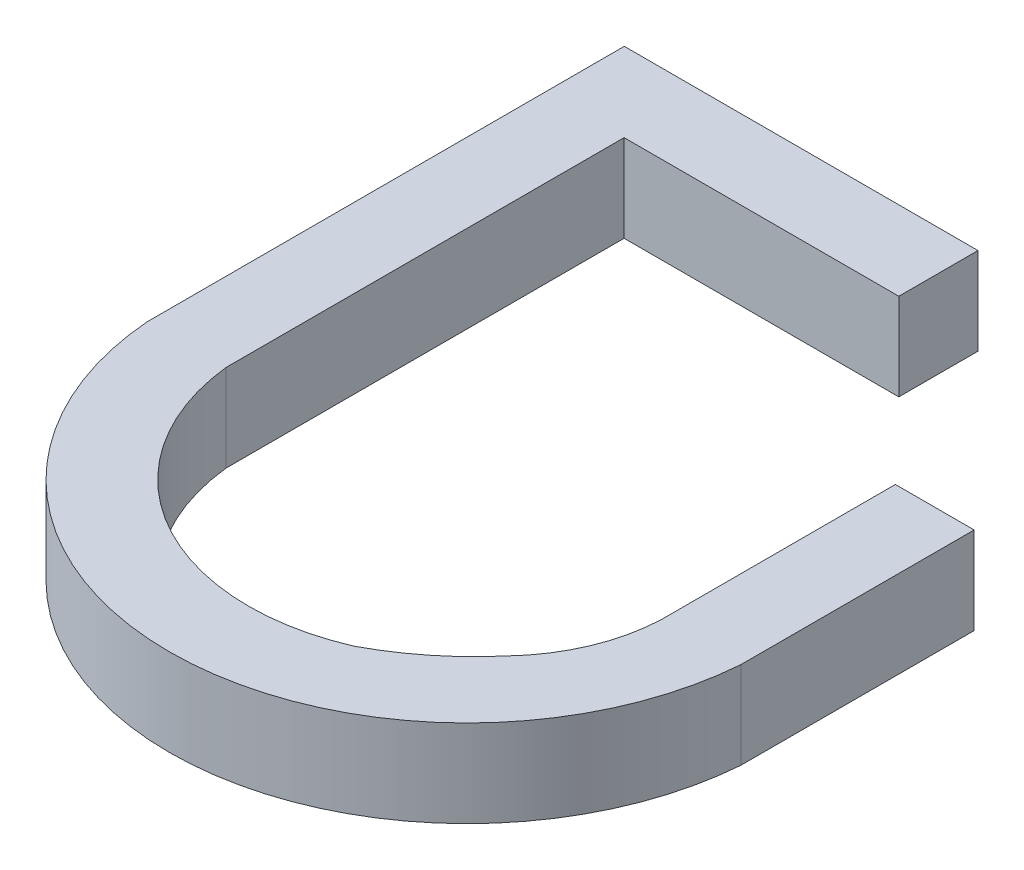
ISO-10303-21;
HEADER;
FILE_DESCRIPTION(('STEP AP214'),'2;1');
FILE_NAME('part.step','',(''),(''),'','','');
FILE_SCHEMA(('AUTOMOTIVE_DESIGN { 1 0 10303 214 1 1 1 1 }'));
ENDSEC;
DATA;
#1=APPLICATION_CONTEXT('core data for automotive mechanical design processes');
#2=APPLICATION_PROTOCOL_DEFINITION('international standard','automotive_design',2000,#1);
#3=PRODUCT_CONTEXT('',#1,'mechanical');
#4=PRODUCT('Part','Part','',(#3));
#5=PRODUCT_RELATED_PRODUCT_CATEGORY('part','',(#4));
#6=PRODUCT_DEFINITION_FORMATION('','',#4);
#7=PRODUCT_DEFINITION_CONTEXT('part definition',#1,'design');
#8=PRODUCT_DEFINITION('design','',#6,#7);
#9=PRODUCT_DEFINITION_SHAPE('','',#8);
#10=(LENGTH_UNIT() NAMED_UNIT(*) SI_UNIT(.MILLI.,.METRE.));
#11=(NAMED_UNIT(*) PLANE_ANGLE_UNIT() SI_UNIT($,.RADIAN.));
#12=(NAMED_UNIT(*) SI_UNIT($,.STERADIAN.) SOLID_ANGLE_UNIT());
#13=UNCERTAINTY_MEASURE_WITH_UNIT(LENGTH_MEASURE(1.E-05),#10,'distance_accuracy_value','');
#14=(GEOMETRIC_REPRESENTATION_CONTEXT(3) GLOBAL_UNCERTAINTY_ASSIGNED_CONTEXT((#13)) GLOBAL_UNIT_ASSIGNED_CONTEXT((#10,
#11,#12)) REPRESENTATION_CONTEXT('',''));
#15=CARTESIAN_POINT('',(0.,0.,0.));
#16=DIRECTION('',(0.,0.,1.));
#17=DIRECTION('',(1.,0.,0.));
#18=AXIS2_PLACEMENT_3D('',#15,#16,#17);
#19=CARTESIAN_POINT('',(86.487166974426,25.4,-86.7884043944306));
#20=DIRECTION('',(0.,1.,0.));
#21=DIRECTION('',(0.,0.,1.));
#22=AXIS2_PLACEMENT_3D('',#19,#20,#21);
#23=PLANE('',#22);
#24=CARTESIAN_POINT('',(86.518970104668,25.4,-86.964878381126));
#25=DIRECTION('',(0.,1.,0.));
#26=DIRECTION('',(0.,0.,1.));
#27=AXIS2_PLACEMENT_3D('',#24,#25,#26);
#28=CIRCLE('',#27,63.8849185867954);
#29=CARTESIAN_POINT('',(23.0118290964539,25.4,-80.0275976599587));
#30=VERTEX_POINT('',#29);
#31=CARTESIAN_POINT('',(112.066438028889,25.4,-28.4105471536038));
#32=VERTEX_POINT('',#31);
#33=EDGE_CURVE('E226',#30,#32,#28,.T.);
#34=ORIENTED_EDGE('',*,*,#33,.F.);
#35=DIRECTION('',(0.,0.,-1.));
#36=VECTOR('',#35,1.);
#37=CARTESIAN_POINT('',(23.0118290964539,25.4,-195.999460881352));
#38=LINE('',#37,#36);
#39=CARTESIAN_POINT('',(23.0118290964539,25.4,-195.999460881352));
#40=VERTEX_POINT('',#39);
#41=EDGE_CURVE('E42',#30,#40,#38,.T.);
#42=ORIENTED_EDGE('',*,*,#41,.T.);
#43=DIRECTION('',(1.,0.,0.));
#44=VECTOR('',#43,1.);
#45=CARTESIAN_POINT('',(103.040086397792,25.4,-195.999460881352));
#46=LINE('',#45,#44);
#47=CARTESIAN_POINT('',(103.040086397792,25.4,-195.999460881352));
#48=VERTEX_POINT('',#47);
#49=EDGE_CURVE('E132',#40,#48,#46,.T.);
#50=ORIENTED_EDGE('',*,*,#49,.T.);
#51=DIRECTION('',(0.,0.,-1.));
#52=VECTOR('',#51,1.);
#53=CARTESIAN_POINT('',(103.040086397792,25.4,-219.067642019415));
#54=LINE('',#53,#52);
#55=CARTESIAN_POINT('',(103.040086397792,25.4,-219.067642019415));
#56=VERTEX_POINT('',#55);
#57=EDGE_CURVE('E125',#48,#56,#54,.T.);
#58=ORIENTED_EDGE('',*,*,#57,.T.);
#59=DIRECTION('',(-1.,0.,0.));
#60=VECTOR('',#59,1.);
#61=CARTESIAN_POINT('',(0.,25.4,-219.067642019415));
#62=LINE('',#61,#60);
#63=CARTESIAN_POINT('',(0.,25.4,-219.067642019415));
#64=VERTEX_POINT('',#63);
#65=EDGE_CURVE('E129',#56,#64,#62,.T.);
#66=ORIENTED_EDGE('',*,*,#65,.T.);
#67=DIRECTION('',(0.,0.,1.));
#68=VECTOR('',#67,1.);
#69=CARTESIAN_POINT('',(0.,25.4,-80.0275976599587));
#70=LINE('',#69,#68);
#71=CARTESIAN_POINT('',(0.,25.4,-80.0275976599587));
#72=VERTEX_POINT('',#71);
#73=EDGE_CURVE('E63',#64,#72,#70,.T.);
#74=ORIENTED_EDGE('',*,*,#73,.T.);
#75=CARTESIAN_POINT('',(86.487166974426,25.4,-86.7884043944306));
#76=DIRECTION('',(0.,1.,0.));
#77=DIRECTION('',(0.,0.,1.));
#78=AXIS2_PLACEMENT_3D('',#75,#76,#77);
#79=CIRCLE('',#78,86.7510147431322);
#80=CARTESIAN_POINT('',(172.974333948852,25.4,-80.0275976599587));
#81=VERTEX_POINT('',#80);
#82=EDGE_CURVE('E173',#72,#81,#79,.T.);
#83=ORIENTED_EDGE('',*,*,#82,.T.);
#84=DIRECTION('',(0.,0.,-1.));
#85=VECTOR('',#84,1.);
#86=CARTESIAN_POINT('',(172.974333948852,25.4,-80.0275976599587));
#87=LINE('',#86,#85);
#88=CARTESIAN_POINT('',(172.974333948852,25.4,-148.011746995585));
#89=VERTEX_POINT('',#88);
#90=EDGE_CURVE('E106',#81,#89,#87,.T.);
#91=ORIENTED_EDGE('',*,*,#90,.T.);
#92=DIRECTION('',(-1.,0.,0.));
#93=VECTOR('',#92,1.);
#94=CARTESIAN_POINT('',(150.026111112882,25.4,-148.011746995585));
#95=LINE('',#94,#93);
#96=CARTESIAN_POINT('',(150.026111112882,25.4,-148.011746995585));
#97=VERTEX_POINT('',#96);
#98=EDGE_CURVE('E195',#89,#97,#95,.T.);
#99=ORIENTED_EDGE('',*,*,#98,.T.);
#100=DIRECTION('',(0.,0.,1.));
#101=VECTOR('',#100,1.);
#102=CARTESIAN_POINT('',(150.026111112882,25.4,-80.0275976599587));
#103=LINE('',#102,#101);
#104=CARTESIAN_POINT('',(150.026111112882,25.4,-80.0275976599587));
#105=VERTEX_POINT('',#104);
#106=EDGE_CURVE('E214',#97,#105,#103,.T.);
#107=ORIENTED_EDGE('',*,*,#106,.T.);
#108=CARTESIAN_POINT('',(101.122321747501,25.4,-81.7614654621829));
#109=DIRECTION('',(0.,-1.,0.));
#110=DIRECTION('',(0.,0.,1.));
#111=AXIS2_PLACEMENT_3D('',#108,#109,#110);
#112=CIRCLE('',#111,48.9345165690762);
#113=CARTESIAN_POINT('',(136.744902109116,25.4,-48.2112243269925));
#114=VERTEX_POINT('',#113);
#115=EDGE_CURVE('E211',#105,#114,#112,.T.);
#116=ORIENTED_EDGE('',*,*,#115,.T.);
#117=CARTESIAN_POINT('',(72.7034977462678,25.4,-102.749601212673));
#118=DIRECTION('',(0.,1.,0.));
#119=DIRECTION('',(0.,0.,1.));
#120=AXIS2_PLACEMENT_3D('',#117,#118,#119);
#121=CIRCLE('',#120,84.1173943134857);
#122=EDGE_CURVE('E229',#32,#114,#121,.T.);
#123=ORIENTED_EDGE('',*,*,#122,.F.);
#124=EDGE_LOOP('',(#34,#42,#50,#58,#66,#74,#83,#91,#99,#107,#116,#123));
#125=FACE_BOUND('',#124,.T.);
#126=ADVANCED_FACE('F38',(#125),#23,.T.);
#127=CARTESIAN_POINT('',(86.487166974426,0.,-86.7884043944306));
#128=DIRECTION('',(0.,1.,0.));
#129=DIRECTION('',(0.,0.,1.));
#130=AXIS2_PLACEMENT_3D('',#127,#128,#129);
#131=PLANE('',#130);
#132=DIRECTION('',(0.,0.,-1.));
#133=VECTOR('',#132,1.);
#134=CARTESIAN_POINT('',(23.0118290964539,0.,-195.999460881352));
#135=LINE('',#134,#133);
#136=CARTESIAN_POINT('',(23.0118290964539,0.,-80.0275976599587));
#137=VERTEX_POINT('',#136);
#138=CARTESIAN_POINT('',(23.0118290964539,0.,-195.999460881352));
#139=VERTEX_POINT('',#138);
#140=EDGE_CURVE('E54',#137,#139,#135,.T.);
#141=ORIENTED_EDGE('',*,*,#140,.F.);
#142=CARTESIAN_POINT('',(86.518970104668,0.,-86.964878381126));
#143=DIRECTION('',(0.,1.,0.));
#144=DIRECTION('',(0.,0.,1.));
#145=AXIS2_PLACEMENT_3D('',#142,#143,#144);
#146=CIRCLE('',#145,63.8849185867954);
#147=CARTESIAN_POINT('',(112.066438028889,0.,-28.4105471536038));
#148=VERTEX_POINT('',#147);
#149=EDGE_CURVE('E227',#137,#148,#146,.T.);
#150=ORIENTED_EDGE('',*,*,#149,.T.);
#151=CARTESIAN_POINT('',(72.7034977462678,0.,-102.749601212673));
#152=DIRECTION('',(0.,1.,0.));
#153=DIRECTION('',(0.,0.,1.));
#154=AXIS2_PLACEMENT_3D('',#151,#152,#153);
#155=CIRCLE('',#154,84.1173943134857);
#156=CARTESIAN_POINT('',(136.744902109116,0.,-48.2112243269925));
#157=VERTEX_POINT('',#156);
#158=EDGE_CURVE('E234',#148,#157,#155,.T.);
#159=ORIENTED_EDGE('',*,*,#158,.T.);
#160=CARTESIAN_POINT('',(101.122321747501,0.,-81.7614654621829));
#161=DIRECTION('',(0.,-1.,0.));
#162=DIRECTION('',(0.,0.,1.));
#163=AXIS2_PLACEMENT_3D('',#160,#161,#162);
#164=CIRCLE('',#163,48.9345165690762);
#165=CARTESIAN_POINT('',(150.026111112882,0.,-80.0275976599587));
#166=VERTEX_POINT('',#165);
#167=EDGE_CURVE('E163',#166,#157,#164,.T.);
#168=ORIENTED_EDGE('',*,*,#167,.F.);
#169=DIRECTION('',(0.,0.,1.));
#170=VECTOR('',#169,1.);
#171=CARTESIAN_POINT('',(150.026111112882,0.,-80.0275976599587));
#172=LINE('',#171,#170);
#173=CARTESIAN_POINT('',(150.026111112882,0.,-148.011746995585));
#174=VERTEX_POINT('',#173);
#175=EDGE_CURVE('E161',#174,#166,#172,.T.);
#176=ORIENTED_EDGE('',*,*,#175,.F.);
#177=DIRECTION('',(-1.,0.,0.));
#178=VECTOR('',#177,1.);
#179=CARTESIAN_POINT('',(150.026111112882,0.,-148.011746995585));
#180=LINE('',#179,#178);
#181=CARTESIAN_POINT('',(172.974333948852,0.,-148.011746995585));
#182=VERTEX_POINT('',#181);
#183=EDGE_CURVE('E159',#182,#174,#180,.T.);
#184=ORIENTED_EDGE('',*,*,#183,.F.);
#185=DIRECTION('',(0.,0.,-1.));
#186=VECTOR('',#185,1.);
#187=CARTESIAN_POINT('',(172.974333948852,0.,-80.0275976599587));
#188=LINE('',#187,#186);
#189=CARTESIAN_POINT('',(172.974333948852,0.,-80.0275976599587));
#190=VERTEX_POINT('',#189);
#191=EDGE_CURVE('E156',#190,#182,#188,.T.);
#192=ORIENTED_EDGE('',*,*,#191,.F.);
#193=CARTESIAN_POINT('',(86.487166974426,0.,-86.7884043944306));
#194=DIRECTION('',(0.,1.,0.));
#195=DIRECTION('',(0.,0.,1.));
#196=AXIS2_PLACEMENT_3D('',#193,#194,#195);
#197=CIRCLE('',#196,86.7510147431322);
#198=CARTESIAN_POINT('',(0.,0.,-80.0275976599587));
#199=VERTEX_POINT('',#198);
#200=EDGE_CURVE('E153',#199,#190,#197,.T.);
#201=ORIENTED_EDGE('',*,*,#200,.F.);
#202=DIRECTION('',(0.,0.,1.));
#203=VECTOR('',#202,1.);
#204=CARTESIAN_POINT('',(0.,0.,-80.0275976599587));
#205=LINE('',#204,#203);
#206=CARTESIAN_POINT('',(0.,0.,-219.067642019415));
#207=VERTEX_POINT('',#206);
#208=EDGE_CURVE('E98',#207,#199,#205,.T.);
#209=ORIENTED_EDGE('',*,*,#208,.F.);
#210=DIRECTION('',(-1.,0.,0.));
#211=VECTOR('',#210,1.);
#212=CARTESIAN_POINT('',(0.,0.,-219.067642019415));
#213=LINE('',#212,#211);
#214=CARTESIAN_POINT('',(103.040086397792,0.,-219.067642019415));
#215=VERTEX_POINT('',#214);
#216=EDGE_CURVE('E170',#215,#207,#213,.T.);
#217=ORIENTED_EDGE('',*,*,#216,.F.);
#218=DIRECTION('',(0.,0.,-1.));
#219=VECTOR('',#218,1.);
#220=CARTESIAN_POINT('',(103.040086397792,0.,-219.067642019415));
#221=LINE('',#220,#219);
#222=CARTESIAN_POINT('',(103.040086397792,0.,-195.999460881352));
#223=VERTEX_POINT('',#222);
#224=EDGE_CURVE('E141',#223,#215,#221,.T.);
#225=ORIENTED_EDGE('',*,*,#224,.F.);
#226=DIRECTION('',(1.,0.,0.));
#227=VECTOR('',#226,1.);
#228=CARTESIAN_POINT('',(103.040086397792,0.,-195.999460881352));
#229=LINE('',#228,#227);
#230=EDGE_CURVE('E167',#139,#223,#229,.T.);
#231=ORIENTED_EDGE('',*,*,#230,.F.);
#232=EDGE_LOOP('',(#141,#150,#159,#168,#176,#184,#192,#201,#209,#217,#225,#231));
#233=FACE_BOUND('',#232,.T.);
#234=ADVANCED_FACE('F197',(#233),#131,.F.);
#235=CARTESIAN_POINT('',(86.487166974426,25.4,-86.7884043944306));
#236=DIRECTION('',(0.,-1.,0.));
#237=DIRECTION('',(0.,0.,-1.));
#238=AXIS2_PLACEMENT_3D('',#235,#236,#237);
#239=CYLINDRICAL_SURFACE('',#238,86.7510147431322);
#240=ORIENTED_EDGE('',*,*,#200,.T.);
#241=DIRECTION('',(0.,-1.,0.));
#242=VECTOR('',#241,1.);
#243=CARTESIAN_POINT('',(172.974333948852,25.4,-80.0275976599587));
#244=LINE('',#243,#242);
#245=EDGE_CURVE('E11',#81,#190,#244,.T.);
#246=ORIENTED_EDGE('',*,*,#245,.F.);
#247=ORIENTED_EDGE('',*,*,#82,.F.);
#248=DIRECTION('',(0.,-1.,0.));
#249=VECTOR('',#248,1.);
#250=CARTESIAN_POINT('',(0.,25.4,-80.0275976599587));
#251=LINE('',#250,#249);
#252=EDGE_CURVE('E149',#72,#199,#251,.T.);
#253=ORIENTED_EDGE('',*,*,#252,.T.);
#254=EDGE_LOOP('',(#240,#246,#247,#253));
#255=FACE_BOUND('',#254,.T.);
#256=ADVANCED_FACE('F40',(#255),#239,.T.);
#257=CARTESIAN_POINT('',(172.974333948852,25.4,-80.0275976599587));
#258=DIRECTION('',(-1.,0.,0.));
#259=DIRECTION('',(0.,0.,1.));
#260=AXIS2_PLACEMENT_3D('',#257,#258,#259);
#261=PLANE('',#260);
#262=ORIENTED_EDGE('',*,*,#191,.T.);
#263=DIRECTION('',(0.,-1.,0.));
#264=VECTOR('',#263,1.);
#265=CARTESIAN_POINT('',(172.974333948852,25.4,-148.011746995585));
#266=LINE('',#265,#264);
#267=EDGE_CURVE('E47',#89,#182,#266,.T.);
#268=ORIENTED_EDGE('',*,*,#267,.F.);
#269=ORIENTED_EDGE('',*,*,#90,.F.);
#270=ORIENTED_EDGE('',*,*,#245,.T.);
#271=EDGE_LOOP('',(#262,#268,#269,#270));
#272=FACE_BOUND('',#271,.T.);
#273=ADVANCED_FACE('F256',(#272),#261,.F.);
#274=CARTESIAN_POINT('',(150.026111112882,25.4,-148.011746995585));
#275=DIRECTION('',(0.,0.,1.));
#276=DIRECTION('',(1.,0.,0.));
#277=AXIS2_PLACEMENT_3D('',#274,#275,#276);
#278=PLANE('',#277);
#279=ORIENTED_EDGE('',*,*,#183,.T.);
#280=DIRECTION('',(0.,-1.,0.));
#281=VECTOR('',#280,1.);
#282=CARTESIAN_POINT('',(150.026111112882,25.4,-148.011746995585));
#283=LINE('',#282,#281);
#284=EDGE_CURVE('E186',#97,#174,#283,.T.);
#285=ORIENTED_EDGE('',*,*,#284,.F.);
#286=ORIENTED_EDGE('',*,*,#98,.F.);
#287=ORIENTED_EDGE('',*,*,#267,.T.);
#288=EDGE_LOOP('',(#279,#285,#286,#287));
#289=FACE_BOUND('',#288,.T.);
#290=ADVANCED_FACE('F193',(#289),#278,.F.);
#291=CARTESIAN_POINT('',(150.026111112882,25.4,-80.0275976599587));
#292=DIRECTION('',(1.,0.,0.));
#293=DIRECTION('',(0.,0.,-1.));
#294=AXIS2_PLACEMENT_3D('',#291,#292,#293);
#295=PLANE('',#294);
#296=ORIENTED_EDGE('',*,*,#175,.T.);
#297=DIRECTION('',(0.,-1.,0.));
#298=VECTOR('',#297,1.);
#299=CARTESIAN_POINT('',(150.026111112882,25.4,-80.0275976599587));
#300=LINE('',#299,#298);
#301=EDGE_CURVE('E183',#105,#166,#300,.T.);
#302=ORIENTED_EDGE('',*,*,#301,.F.);
#303=ORIENTED_EDGE('',*,*,#106,.F.);
#304=ORIENTED_EDGE('',*,*,#284,.T.);
#305=EDGE_LOOP('',(#296,#302,#303,#304));
#306=FACE_BOUND('',#305,.T.);
#307=ADVANCED_FACE('F203',(#306),#295,.F.);
#308=CARTESIAN_POINT('',(101.122321747501,25.4,-81.7614654621829));
#309=DIRECTION('',(0.,-1.,0.));
#310=DIRECTION('',(0.,0.,-1.));
#311=AXIS2_PLACEMENT_3D('',#308,#309,#310);
#312=CYLINDRICAL_SURFACE('',#311,48.9345165690762);
#313=ORIENTED_EDGE('',*,*,#167,.T.);
#314=DIRECTION('',(0.,-1.,0.));
#315=VECTOR('',#314,1.);
#316=CARTESIAN_POINT('',(136.744902109116,25.4,-48.2112243269925));
#317=LINE('',#316,#315);
#318=EDGE_CURVE('E180',#114,#157,#317,.T.);
#319=ORIENTED_EDGE('',*,*,#318,.F.);
#320=ORIENTED_EDGE('',*,*,#115,.F.);
#321=ORIENTED_EDGE('',*,*,#301,.T.);
#322=EDGE_LOOP('',(#313,#319,#320,#321));
#323=FACE_BOUND('',#322,.T.);
#324=ADVANCED_FACE('F207',(#323),#312,.F.);
#325=CARTESIAN_POINT('',(23.0118290964539,25.4,-195.999460881352));
#326=DIRECTION('',(-1.,0.,0.));
#327=DIRECTION('',(0.,0.,1.));
#328=AXIS2_PLACEMENT_3D('',#325,#326,#327);
#329=PLANE('',#328);
#330=ORIENTED_EDGE('',*,*,#140,.T.);
#331=DIRECTION('',(0.,-1.,0.));
#332=VECTOR('',#331,1.);
#333=CARTESIAN_POINT('',(23.0118290964539,25.4,-195.999460881352));
#334=LINE('',#333,#332);
#335=EDGE_CURVE('E177',#40,#139,#334,.T.);
#336=ORIENTED_EDGE('',*,*,#335,.F.);
#337=ORIENTED_EDGE('',*,*,#41,.F.);
#338=DIRECTION('',(0.,-1.,0.));
#339=VECTOR('',#338,1.);
#340=CARTESIAN_POINT('',(23.0118290964539,25.4,-80.0275976599587));
#341=LINE('',#340,#339);
#342=EDGE_CURVE('E223',#30,#137,#341,.T.);
#343=ORIENTED_EDGE('',*,*,#342,.T.);
#344=EDGE_LOOP('',(#330,#336,#337,#343));
#345=FACE_BOUND('',#344,.T.);
#346=ADVANCED_FACE('F249',(#345),#329,.F.);
#347=CARTESIAN_POINT('',(103.040086397792,25.4,-195.999460881352));
#348=DIRECTION('',(0.,0.,-1.));
#349=DIRECTION('',(-1.,0.,0.));
#350=AXIS2_PLACEMENT_3D('',#347,#348,#349);
#351=PLANE('',#350);
#352=ORIENTED_EDGE('',*,*,#230,.T.);
#353=DIRECTION('',(0.,-1.,0.));
#354=VECTOR('',#353,1.);
#355=CARTESIAN_POINT('',(103.040086397792,25.4,-195.999460881352));
#356=LINE('',#355,#354);
#357=EDGE_CURVE('E144',#48,#223,#356,.T.);
#358=ORIENTED_EDGE('',*,*,#357,.F.);
#359=ORIENTED_EDGE('',*,*,#49,.F.);
#360=ORIENTED_EDGE('',*,*,#335,.T.);
#361=EDGE_LOOP('',(#352,#358,#359,#360));
#362=FACE_BOUND('',#361,.T.);
#363=ADVANCED_FACE('F251',(#362),#351,.F.);
#364=CARTESIAN_POINT('',(103.040086397792,25.4,-219.067642019415));
#365=DIRECTION('',(-1.,0.,0.));
#366=DIRECTION('',(0.,0.,1.));
#367=AXIS2_PLACEMENT_3D('',#364,#365,#366);
#368=PLANE('',#367);
#369=ORIENTED_EDGE('',*,*,#224,.T.);
#370=DIRECTION('',(0.,-1.,0.));
#371=VECTOR('',#370,1.);
#372=CARTESIAN_POINT('',(103.040086397792,25.4,-219.067642019415));
#373=LINE('',#372,#371);
#374=EDGE_CURVE('E138',#56,#215,#373,.T.);
#375=ORIENTED_EDGE('',*,*,#374,.F.);
#376=ORIENTED_EDGE('',*,*,#57,.F.);
#377=ORIENTED_EDGE('',*,*,#357,.T.);
#378=EDGE_LOOP('',(#369,#375,#376,#377));
#379=FACE_BOUND('',#378,.T.);
#380=ADVANCED_FACE('F139',(#379),#368,.F.);
#381=CARTESIAN_POINT('',(0.,25.4,-219.067642019415));
#382=DIRECTION('',(0.,0.,1.));
#383=DIRECTION('',(1.,0.,0.));
#384=AXIS2_PLACEMENT_3D('',#381,#382,#383);
#385=PLANE('',#384);
#386=ORIENTED_EDGE('',*,*,#216,.T.);
#387=DIRECTION('',(0.,-1.,0.));
#388=VECTOR('',#387,1.);
#389=CARTESIAN_POINT('',(0.,25.4,-219.067642019415));
#390=LINE('',#389,#388);
#391=EDGE_CURVE('E145',#64,#207,#390,.T.);
#392=ORIENTED_EDGE('',*,*,#391,.F.);
#393=ORIENTED_EDGE('',*,*,#65,.F.);
#394=ORIENTED_EDGE('',*,*,#374,.T.);
#395=EDGE_LOOP('',(#386,#392,#393,#394));
#396=FACE_BOUND('',#395,.T.);
#397=ADVANCED_FACE('F147',(#396),#385,.F.);
#398=CARTESIAN_POINT('',(0.,25.4,-80.0275976599587));
#399=DIRECTION('',(1.,0.,0.));
#400=DIRECTION('',(0.,0.,-1.));
#401=AXIS2_PLACEMENT_3D('',#398,#399,#400);
#402=PLANE('',#401);
#403=ORIENTED_EDGE('',*,*,#208,.T.);
#404=ORIENTED_EDGE('',*,*,#252,.F.);
#405=ORIENTED_EDGE('',*,*,#73,.F.);
#406=ORIENTED_EDGE('',*,*,#391,.T.);
#407=EDGE_LOOP('',(#403,#404,#405,#406));
#408=FACE_BOUND('',#407,.T.);
#409=ADVANCED_FACE('F252',(#408),#402,.F.);
#410=CARTESIAN_POINT('',(86.518970104668,25.4,-86.964878381126));
#411=DIRECTION('',(0.,-1.,0.));
#412=DIRECTION('',(0.,0.,-1.));
#413=AXIS2_PLACEMENT_3D('',#410,#411,#412);
#414=CYLINDRICAL_SURFACE('',#413,63.8849185867954);
#415=ORIENTED_EDGE('',*,*,#149,.F.);
#416=ORIENTED_EDGE('',*,*,#342,.F.);
#417=ORIENTED_EDGE('',*,*,#33,.T.);
#418=DIRECTION('',(0.,-1.,0.));
#419=VECTOR('',#418,1.);
#420=CARTESIAN_POINT('',(112.066438028889,25.4,-28.4105471536038));
#421=LINE('',#420,#419);
#422=EDGE_CURVE('E157',#32,#148,#421,.T.);
#423=ORIENTED_EDGE('',*,*,#422,.T.);
#424=EDGE_LOOP('',(#415,#416,#417,#423));
#425=FACE_BOUND('',#424,.T.);
#426=ADVANCED_FACE('F242',(#425),#414,.F.);
#427=CARTESIAN_POINT('',(72.7034977462678,0.,-102.749601212673));
#428=DIRECTION('',(0.,1.,0.));
#429=DIRECTION('',(0.,0.,1.));
#430=AXIS2_PLACEMENT_3D('',#427,#428,#429);
#431=CYLINDRICAL_SURFACE('',#430,84.1173943134857);
#432=ORIENTED_EDGE('',*,*,#122,.T.);
#433=ORIENTED_EDGE('',*,*,#318,.T.);
#434=ORIENTED_EDGE('',*,*,#158,.F.);
#435=ORIENTED_EDGE('',*,*,#422,.F.);
#436=EDGE_LOOP('',(#432,#433,#434,#435));
#437=FACE_BOUND('',#436,.T.);
#438=ADVANCED_FACE('F240',(#437),#431,.F.);
#439=CLOSED_SHELL('',(#126,#234,#256,#273,#290,#307,#324,#346,#363,#380,#397,#409,#426,#438));
#440=MANIFOLD_SOLID_BREP('B2',#439);
#441=ADVANCED_BREP_SHAPE_REPRESENTATION('',(#18,#440),#14);
#442=SHAPE_DEFINITION_REPRESENTATION(#9,#441);
ENDSEC;
END-ISO-10303-21;
